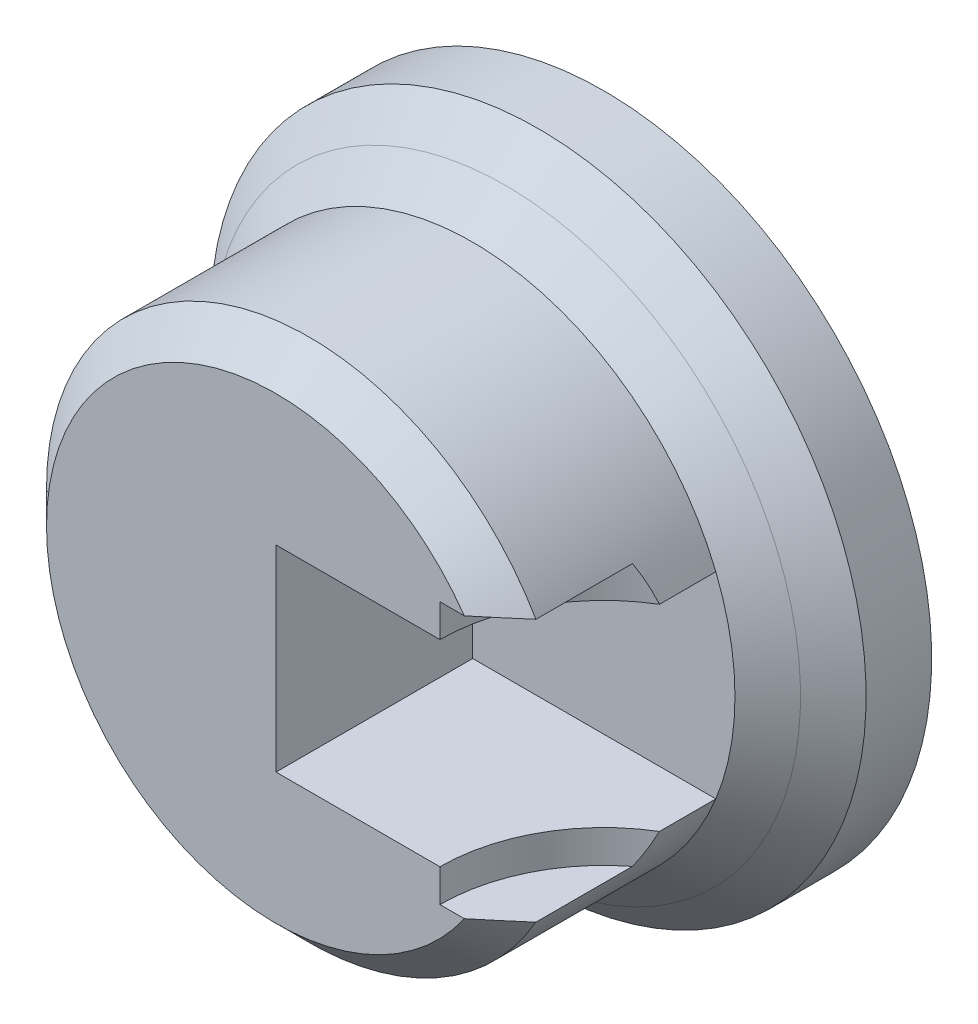
ISO-10303-21;
HEADER;
FILE_DESCRIPTION(('STEP AP214'),'2;1');
FILE_NAME('part.step','',(''),(''),'','','');
FILE_SCHEMA(('AUTOMOTIVE_DESIGN { 1 0 10303 214 1 1 1 1 }'));
ENDSEC;
DATA;
#1=APPLICATION_CONTEXT('core data for automotive mechanical design processes');
#2=APPLICATION_PROTOCOL_DEFINITION('international standard','automotive_design',2000,#1);
#3=PRODUCT_CONTEXT('',#1,'mechanical');
#4=PRODUCT('Part','Part','',(#3));
#5=PRODUCT_RELATED_PRODUCT_CATEGORY('part','',(#4));
#6=PRODUCT_DEFINITION_FORMATION('','',#4);
#7=PRODUCT_DEFINITION_CONTEXT('part definition',#1,'design');
#8=PRODUCT_DEFINITION('design','',#6,#7);
#9=PRODUCT_DEFINITION_SHAPE('','',#8);
#10=(LENGTH_UNIT() NAMED_UNIT(*) SI_UNIT(.MILLI.,.METRE.));
#11=(NAMED_UNIT(*) PLANE_ANGLE_UNIT() SI_UNIT($,.RADIAN.));
#12=(NAMED_UNIT(*) SI_UNIT($,.STERADIAN.) SOLID_ANGLE_UNIT());
#13=UNCERTAINTY_MEASURE_WITH_UNIT(LENGTH_MEASURE(1.E-05),#10,'distance_accuracy_value','');
#14=(GEOMETRIC_REPRESENTATION_CONTEXT(3) GLOBAL_UNCERTAINTY_ASSIGNED_CONTEXT((#13)) GLOBAL_UNIT_ASSIGNED_CONTEXT((#10,
#11,#12)) REPRESENTATION_CONTEXT('',''));
#15=CARTESIAN_POINT('',(0.,0.,0.));
#16=DIRECTION('',(0.,0.,1.));
#17=DIRECTION('',(1.,0.,0.));
#18=AXIS2_PLACEMENT_3D('',#15,#16,#17);
#19=CARTESIAN_POINT('',(0.,0.,-2.5));
#20=DIRECTION('',(0.,0.,1.));
#21=DIRECTION('',(1.,0.,0.));
#22=AXIS2_PLACEMENT_3D('',#19,#20,#21);
#23=CYLINDRICAL_SURFACE('',#22,4.);
#24=DIRECTION('',(0.,0.,1.));
#25=VECTOR('',#24,1.);
#26=CARTESIAN_POINT('',(3.70809924354783,1.5,-2.5));
#27=LINE('',#26,#25);
#28=CARTESIAN_POINT('',(3.70809924354783,1.5,-0.5));
#29=VERTEX_POINT('',#28);
#30=CARTESIAN_POINT('',(3.70809924354783,1.5,0.359674689333811));
#31=VERTEX_POINT('',#30);
#32=EDGE_CURVE('E160',#29,#31,#27,.T.);
#33=ORIENTED_EDGE('',*,*,#32,.F.);
#34=CARTESIAN_POINT('',(0.,0.,-0.499999999999993));
#35=DIRECTION('',(0.,0.,-1.));
#36=DIRECTION('',(-1.,0.,0.));
#37=AXIS2_PLACEMENT_3D('',#34,#35,#36);
#38=CIRCLE('',#37,4.);
#39=CARTESIAN_POINT('',(3.70809924354783,-1.5,-0.5));
#40=VERTEX_POINT('',#39);
#41=EDGE_CURVE('E207',#29,#40,#38,.F.);
#42=ORIENTED_EDGE('',*,*,#41,.T.);
#43=DIRECTION('',(0.,0.,1.));
#44=VECTOR('',#43,1.);
#45=CARTESIAN_POINT('',(3.70809924354783,-1.5,-2.5));
#46=LINE('',#45,#44);
#47=CARTESIAN_POINT('',(3.70809924354783,-1.5,0.35967468933381));
#48=VERTEX_POINT('',#47);
#49=EDGE_CURVE('E155',#48,#40,#46,.F.);
#50=ORIENTED_EDGE('',*,*,#49,.F.);
#51=CARTESIAN_POINT('',(3.46410161513775,2.,0.527434119889135));
#52=CARTESIAN_POINT('',(3.50562560971937,1.92814357787621,0.495137636151299));
#53=CARTESIAN_POINT('',(3.54547378311927,1.8538966149574,0.466179679588769));
#54=CARTESIAN_POINT('',(3.62106919687792,1.70147423965995,0.414169698945883));
#55=CARTESIAN_POINT('',(3.65682155860498,1.62330391296189,0.391110253912465));
#56=CARTESIAN_POINT('',(3.72340968799511,1.46412004738074,0.35015615388205));
#57=CARTESIAN_POINT('',(3.7542702358269,1.3831235524039,0.33223506974557));
#58=CARTESIAN_POINT('',(3.81087414223492,1.21852794952602,0.300674582364985));
#59=CARTESIAN_POINT('',(3.83661587759851,1.13492802574792,0.287036536511759));
#60=CARTESIAN_POINT('',(3.88254630052729,0.966151558570928,0.263493961082745));
#61=CARTESIAN_POINT('',(3.90276125512357,0.880984601373542,0.253571685320262));
#62=CARTESIAN_POINT('',(3.93760713534529,0.709180013785521,0.236883846416933));
#63=CARTESIAN_POINT('',(3.95223583937106,0.622541812571346,0.23011953893306));
#64=CARTESIAN_POINT('',(3.9757927456931,0.448141519221125,0.219393182310386));
#65=CARTESIAN_POINT('',(3.98470914391553,0.360377479665854,0.215436934018808));
#66=CARTESIAN_POINT('',(3.99672002419088,0.184405444560203,0.210137222534614));
#67=CARTESIAN_POINT('',(3.99981636699115,0.0961975999464612,0.208792924262999));
#68=CARTESIAN_POINT('',(4.00019301838751,-0.0929452407603397,0.208627194307258));
#69=CARTESIAN_POINT('',(3.99657159580003,-0.193883837629049,0.210196937936196));
#70=CARTESIAN_POINT('',(3.98171753979444,-0.395100431380641,0.216764118358967));
#71=CARTESIAN_POINT('',(3.97048388136726,-0.495378337463306,0.221762016764639));
#72=CARTESIAN_POINT('',(3.94055285783935,-0.694368587490894,0.235525963342368));
#73=CARTESIAN_POINT('',(3.92186909355035,-0.793083445342959,0.244285147191498));
#74=CARTESIAN_POINT('',(3.877260654915,-0.988369660654506,0.266152498247121));
#75=CARTESIAN_POINT('',(3.8513373380852,-1.08494141631418,0.279259850198244));
#76=CARTESIAN_POINT('',(3.79947925386363,-1.25290860601893,0.306966252714676));
#77=CARTESIAN_POINT('',(3.77495922905565,-1.32491958560395,0.320503184109033));
#78=CARTESIAN_POINT('',(3.72214021702008,-1.46676447534039,0.351045728107578));
#79=CARTESIAN_POINT('',(3.69384271492068,-1.53659922784149,0.368049978902096));
#80=CARTESIAN_POINT('',(3.63370332425191,-1.67386320260022,0.406078529615961));
#81=CARTESIAN_POINT('',(3.60185155528957,-1.74128499462203,0.427114158691209));
#82=CARTESIAN_POINT('',(3.53512079608088,-1.87307881564676,0.473730727303688));
#83=CARTESIAN_POINT('',(3.5002386127911,-1.93744751459084,0.49931649161482));
#84=CARTESIAN_POINT('',(3.46410161513775,-2.00000000000001,0.527434119889046));
#85=B_SPLINE_CURVE_WITH_KNOTS('',3,(#51,#52,#53,#54,#55,#56,#57,#58,#59,#60,#61,#62,#63,#64,#65,
#66,#67,#68,#69,#70,#71,#72,#73,#74,#75,#76,#77,#78,#79,#80,#81,#82,#83,#84),.UNSPECIFIED.,.F.,
.F.,(4,2,2,2,2,2,2,2,2,2,2,2,2,2,2,2,4),(0.,0.266963377276629,0.533589215792938,
0.79881800008297,1.06413075669451,1.32815973494611,1.59229360597407,1.85697154518002,
2.12156484900632,2.42426023919567,2.7269963962763,3.02918239426479,3.33131176618847,
3.56292706563589,3.79445157145347,4.02663652011698,4.25906915215576),.UNSPECIFIED.);
#86=CARTESIAN_POINT('',(3.46410161513775,-2.,0.527434119889135));
#87=VERTEX_POINT('',#86);
#88=EDGE_CURVE('E124',#48,#87,#85,.T.);
#89=ORIENTED_EDGE('',*,*,#88,.T.);
#90=DIRECTION('',(0.,0.,1.));
#91=VECTOR('',#90,1.);
#92=CARTESIAN_POINT('',(3.46410161513775,-2.,-2.5));
#93=LINE('',#92,#91);
#94=CARTESIAN_POINT('',(3.46410161513775,-2.,2.));
#95=VERTEX_POINT('',#94);
#96=EDGE_CURVE('E121',#87,#95,#93,.T.);
#97=ORIENTED_EDGE('',*,*,#96,.T.);
#98=CARTESIAN_POINT('',(0.,0.,2.));
#99=DIRECTION('',(0.,0.,1.));
#100=DIRECTION('',(1.,0.,0.));
#101=AXIS2_PLACEMENT_3D('',#98,#99,#100);
#102=CIRCLE('',#101,4.);
#103=CARTESIAN_POINT('',(3.46410161513775,2.,2.));
#104=VERTEX_POINT('',#103);
#105=EDGE_CURVE('E55',#95,#104,#102,.F.);
#106=ORIENTED_EDGE('',*,*,#105,.T.);
#107=DIRECTION('',(0.,0.,1.));
#108=VECTOR('',#107,1.);
#109=CARTESIAN_POINT('',(3.46410161513775,2.,-2.5));
#110=LINE('',#109,#108);
#111=CARTESIAN_POINT('',(3.46410161513775,2.,0.527434119889135));
#112=VERTEX_POINT('',#111);
#113=EDGE_CURVE('E127',#112,#104,#110,.T.);
#114=ORIENTED_EDGE('',*,*,#113,.F.);
#115=EDGE_CURVE('E112',#112,#31,#85,.T.);
#116=ORIENTED_EDGE('',*,*,#115,.T.);
#117=EDGE_LOOP('',(#33,#42,#50,#89,#97,#106,#114,#116));
#118=FACE_BOUND('',#117,.T.);
#119=ADVANCED_FACE('F39',(#118),#23,.T.);
#120=CARTESIAN_POINT('',(0.,0.,2.5));
#121=DIRECTION('',(0.,0.,1.));
#122=DIRECTION('',(1.,0.,0.));
#123=AXIS2_PLACEMENT_3D('',#120,#121,#122);
#124=PLANE('',#123);
#125=DIRECTION('',(-1.,0.,0.));
#126=VECTOR('',#125,1.);
#127=CARTESIAN_POINT('',(0.,2.,2.5));
#128=LINE('',#127,#126);
#129=CARTESIAN_POINT('',(2.87228132326901,2.,2.5));
#130=VERTEX_POINT('',#129);
#131=CARTESIAN_POINT('',(2.5,2.,2.5));
#132=VERTEX_POINT('',#131);
#133=EDGE_CURVE('E130',#130,#132,#128,.T.);
#134=ORIENTED_EDGE('',*,*,#133,.F.);
#135=CARTESIAN_POINT('',(0.,0.,2.5));
#136=DIRECTION('',(0.,0.,1.));
#137=DIRECTION('',(1.,0.,0.));
#138=AXIS2_PLACEMENT_3D('',#135,#136,#137);
#139=CIRCLE('',#138,3.5);
#140=CARTESIAN_POINT('',(2.87228132326901,-2.,2.5));
#141=VERTEX_POINT('',#140);
#142=EDGE_CURVE('E172',#130,#141,#139,.T.);
#143=ORIENTED_EDGE('',*,*,#142,.T.);
#144=DIRECTION('',(-1.,0.,0.));
#145=VECTOR('',#144,1.);
#146=CARTESIAN_POINT('',(0.,-2.,2.5));
#147=LINE('',#146,#145);
#148=CARTESIAN_POINT('',(2.5,-2.,2.5));
#149=VERTEX_POINT('',#148);
#150=EDGE_CURVE('E169',#141,#149,#147,.T.);
#151=ORIENTED_EDGE('',*,*,#150,.T.);
#152=DIRECTION('',(0.,-1.,0.));
#153=VECTOR('',#152,1.);
#154=CARTESIAN_POINT('',(2.5,2.,2.5));
#155=LINE('',#154,#153);
#156=CARTESIAN_POINT('',(2.5,-1.5,2.5));
#157=VERTEX_POINT('',#156);
#158=EDGE_CURVE('E131',#149,#157,#155,.F.);
#159=ORIENTED_EDGE('',*,*,#158,.T.);
#160=DIRECTION('',(1.,0.,0.));
#161=VECTOR('',#160,1.);
#162=CARTESIAN_POINT('',(7.99999999999999,-1.49999999999999,2.5));
#163=LINE('',#162,#161);
#164=CARTESIAN_POINT('',(0.,-1.5,2.5));
#165=VERTEX_POINT('',#164);
#166=EDGE_CURVE('E137',#165,#157,#163,.T.);
#167=ORIENTED_EDGE('',*,*,#166,.F.);
#168=DIRECTION('',(0.,-1.,0.));
#169=VECTOR('',#168,1.);
#170=CARTESIAN_POINT('',(0.,-1.5,2.5));
#171=LINE('',#170,#169);
#172=CARTESIAN_POINT('',(0.,1.5,2.5));
#173=VERTEX_POINT('',#172);
#174=EDGE_CURVE('E134',#173,#165,#171,.T.);
#175=ORIENTED_EDGE('',*,*,#174,.F.);
#176=DIRECTION('',(-1.,0.,0.));
#177=VECTOR('',#176,1.);
#178=CARTESIAN_POINT('',(0.,1.5,2.5));
#179=LINE('',#178,#177);
#180=CARTESIAN_POINT('',(2.5,1.5,2.5));
#181=VERTEX_POINT('',#180);
#182=EDGE_CURVE('E162',#181,#173,#179,.T.);
#183=ORIENTED_EDGE('',*,*,#182,.F.);
#184=EDGE_CURVE('E122',#181,#132,#155,.F.);
#185=ORIENTED_EDGE('',*,*,#184,.T.);
#186=EDGE_LOOP('',(#134,#143,#151,#159,#167,#175,#183,#185));
#187=FACE_BOUND('',#186,.T.);
#188=ADVANCED_FACE('F229',(#187),#124,.T.);
#189=CARTESIAN_POINT('',(7.99999999999999,1.5,-0.5));
#190=DIRECTION('',(0.,1.,0.));
#191=DIRECTION('',(-1.,0.,0.));
#192=AXIS2_PLACEMENT_3D('',#189,#190,#191);
#193=PLANE('',#192);
#194=CARTESIAN_POINT('',(5.,1.5,2.5));
#195=DIRECTION('',(0.,1.,0.));
#196=DIRECTION('',(-1.,0.,0.));
#197=AXIS2_PLACEMENT_3D('',#194,#195,#196);
#198=CIRCLE('',#197,2.5);
#199=EDGE_CURVE('E118',#181,#31,#198,.F.);
#200=ORIENTED_EDGE('',*,*,#199,.F.);
#201=ORIENTED_EDGE('',*,*,#182,.T.);
#202=DIRECTION('',(0.,0.,1.));
#203=VECTOR('',#202,1.);
#204=CARTESIAN_POINT('',(0.,1.5,-0.5));
#205=LINE('',#204,#203);
#206=CARTESIAN_POINT('',(0.,1.5,-0.5));
#207=VERTEX_POINT('',#206);
#208=EDGE_CURVE('E149',#207,#173,#205,.T.);
#209=ORIENTED_EDGE('',*,*,#208,.F.);
#210=DIRECTION('',(-1.,0.,0.));
#211=VECTOR('',#210,1.);
#212=CARTESIAN_POINT('',(7.99999999999999,1.5,-0.5));
#213=LINE('',#212,#211);
#214=EDGE_CURVE('E142',#29,#207,#213,.T.);
#215=ORIENTED_EDGE('',*,*,#214,.F.);
#216=ORIENTED_EDGE('',*,*,#32,.T.);
#217=EDGE_LOOP('',(#200,#201,#209,#215,#216));
#218=FACE_BOUND('',#217,.T.);
#219=ADVANCED_FACE('F243',(#218),#193,.F.);
#220=CARTESIAN_POINT('',(7.99999999999999,-1.49999999999999,-0.5));
#221=DIRECTION('',(0.,-1.,0.));
#222=DIRECTION('',(1.,0.,0.));
#223=AXIS2_PLACEMENT_3D('',#220,#221,#222);
#224=PLANE('',#223);
#225=CARTESIAN_POINT('',(5.,-1.5,2.5));
#226=DIRECTION('',(0.,-1.,0.));
#227=DIRECTION('',(1.,0.,0.));
#228=AXIS2_PLACEMENT_3D('',#225,#226,#227);
#229=CIRCLE('',#228,2.5);
#230=EDGE_CURVE('E167',#48,#157,#229,.F.);
#231=ORIENTED_EDGE('',*,*,#230,.F.);
#232=ORIENTED_EDGE('',*,*,#49,.T.);
#233=DIRECTION('',(1.,0.,0.));
#234=VECTOR('',#233,1.);
#235=CARTESIAN_POINT('',(7.99999999999999,-1.49999999999999,-0.5));
#236=LINE('',#235,#234);
#237=CARTESIAN_POINT('',(0.,-1.5,-0.5));
#238=VERTEX_POINT('',#237);
#239=EDGE_CURVE('E147',#238,#40,#236,.T.);
#240=ORIENTED_EDGE('',*,*,#239,.F.);
#241=DIRECTION('',(0.,0.,1.));
#242=VECTOR('',#241,1.);
#243=CARTESIAN_POINT('',(0.,-1.5,-0.5));
#244=LINE('',#243,#242);
#245=EDGE_CURVE('E153',#238,#165,#244,.T.);
#246=ORIENTED_EDGE('',*,*,#245,.T.);
#247=ORIENTED_EDGE('',*,*,#166,.T.);
#248=EDGE_LOOP('',(#231,#232,#240,#246,#247));
#249=FACE_BOUND('',#248,.T.);
#250=ADVANCED_FACE('F235',(#249),#224,.F.);
#251=CARTESIAN_POINT('',(0.,-1.5,-0.5));
#252=DIRECTION('',(-1.,0.,0.));
#253=DIRECTION('',(0.,-1.,0.));
#254=AXIS2_PLACEMENT_3D('',#251,#252,#253);
#255=PLANE('',#254);
#256=ORIENTED_EDGE('',*,*,#174,.T.);
#257=ORIENTED_EDGE('',*,*,#245,.F.);
#258=DIRECTION('',(0.,-1.,0.));
#259=VECTOR('',#258,1.);
#260=CARTESIAN_POINT('',(0.,-1.5,-0.5));
#261=LINE('',#260,#259);
#262=EDGE_CURVE('E144',#207,#238,#261,.T.);
#263=ORIENTED_EDGE('',*,*,#262,.F.);
#264=ORIENTED_EDGE('',*,*,#208,.T.);
#265=EDGE_LOOP('',(#256,#257,#263,#264));
#266=FACE_BOUND('',#265,.T.);
#267=ADVANCED_FACE('F240',(#266),#255,.F.);
#268=CARTESIAN_POINT('',(0.,0.,-0.5));
#269=DIRECTION('',(0.,0.,-1.));
#270=DIRECTION('',(-1.,0.,0.));
#271=AXIS2_PLACEMENT_3D('',#268,#269,#270);
#272=PLANE('',#271);
#273=CARTESIAN_POINT('',(0.,0.,-0.5));
#274=DIRECTION('',(0.,0.,-1.));
#275=DIRECTION('',(-1.,0.,0.));
#276=AXIS2_PLACEMENT_3D('',#273,#274,#275);
#277=CIRCLE('',#276,4.);
#278=EDGE_CURVE('E164',#40,#29,#277,.F.);
#279=ORIENTED_EDGE('',*,*,#278,.T.);
#280=ORIENTED_EDGE('',*,*,#214,.T.);
#281=ORIENTED_EDGE('',*,*,#262,.T.);
#282=ORIENTED_EDGE('',*,*,#239,.T.);
#283=EDGE_LOOP('',(#279,#280,#281,#282));
#284=FACE_BOUND('',#283,.T.);
#285=ADVANCED_FACE('F215',(#284),#272,.F.);
#286=CARTESIAN_POINT('',(5.,2.,2.5));
#287=DIRECTION('',(0.,-1.,0.));
#288=DIRECTION('',(0.,0.,-1.));
#289=AXIS2_PLACEMENT_3D('',#286,#287,#288);
#290=CYLINDRICAL_SURFACE('',#289,2.5);
#291=ORIENTED_EDGE('',*,*,#230,.T.);
#292=ORIENTED_EDGE('',*,*,#158,.F.);
#293=CARTESIAN_POINT('',(5.,-2.,2.5));
#294=DIRECTION('',(0.,1.,0.));
#295=DIRECTION('',(0.,0.,1.));
#296=AXIS2_PLACEMENT_3D('',#293,#294,#295);
#297=CIRCLE('',#296,2.5);
#298=EDGE_CURVE('E132',#87,#149,#297,.T.);
#299=ORIENTED_EDGE('',*,*,#298,.F.);
#300=ORIENTED_EDGE('',*,*,#88,.F.);
#301=EDGE_LOOP('',(#291,#292,#299,#300));
#302=FACE_BOUND('',#301,.T.);
#303=ADVANCED_FACE('F211',(#302),#290,.F.);
#304=CARTESIAN_POINT('',(5.,-2.,2.5));
#305=DIRECTION('',(0.,1.,0.));
#306=DIRECTION('',(0.,0.,1.));
#307=AXIS2_PLACEMENT_3D('',#304,#305,#306);
#308=PLANE('',#307);
#309=ORIENTED_EDGE('',*,*,#150,.F.);
#310=CARTESIAN_POINT('',(2.87228132326901,-2.,2.5));
#311=CARTESIAN_POINT('',(2.92219200388667,-2.,2.45903866958506));
#312=CARTESIAN_POINT('',(2.97193339789598,-2.,2.417871776333));
#313=CARTESIAN_POINT('',(3.07110851751143,-2.,2.33517330531056));
#314=CARTESIAN_POINT('',(3.12054225641917,-2.,2.29364174349662));
#315=CARTESIAN_POINT('',(3.2191369006226,-2.,2.21025714897942));
#316=CARTESIAN_POINT('',(3.2682978081867,-2.,2.16840411895587));
#317=CARTESIAN_POINT('',(3.36637615611675,-2.,2.08440938461169));
#318=CARTESIAN_POINT('',(3.41529358579714,-2.,2.04226766781094));
#319=CARTESIAN_POINT('',(3.46410161513776,-2.,2.00000000000001));
#320=B_SPLINE_CURVE_WITH_KNOTS('',3,(#310,#311,#312,#313,#314,#315,#316,#317,#318,#319),
.UNSPECIFIED.,.F.,.F.,(4,2,2,2,4),(0.,0.193700015339948,0.387391596969621,0.581081565764458,
0.774779961417527),.UNSPECIFIED.);
#321=EDGE_CURVE('E63',#141,#95,#320,.T.);
#322=ORIENTED_EDGE('',*,*,#321,.T.);
#323=ORIENTED_EDGE('',*,*,#96,.F.);
#324=ORIENTED_EDGE('',*,*,#298,.T.);
#325=EDGE_LOOP('',(#309,#322,#323,#324));
#326=FACE_BOUND('',#325,.T.);
#327=ADVANCED_FACE('F183',(#326),#308,.T.);
#328=CARTESIAN_POINT('',(5.,2.,2.5));
#329=DIRECTION('',(0.,1.,0.));
#330=DIRECTION('',(0.,0.,1.));
#331=AXIS2_PLACEMENT_3D('',#328,#329,#330);
#332=CIRCLE('',#331,2.5);
#333=EDGE_CURVE('E115',#112,#132,#332,.T.);
#334=ORIENTED_EDGE('',*,*,#333,.T.);
#335=ORIENTED_EDGE('',*,*,#184,.F.);
#336=ORIENTED_EDGE('',*,*,#199,.T.);
#337=ORIENTED_EDGE('',*,*,#115,.F.);
#338=EDGE_LOOP('',(#334,#335,#336,#337));
#339=FACE_BOUND('',#338,.T.);
#340=ADVANCED_FACE('F114',(#339),#290,.F.);
#341=CARTESIAN_POINT('',(5.,2.,2.5));
#342=DIRECTION('',(0.,1.,0.));
#343=DIRECTION('',(0.,0.,1.));
#344=AXIS2_PLACEMENT_3D('',#341,#342,#343);
#345=PLANE('',#344);
#346=ORIENTED_EDGE('',*,*,#113,.T.);
#347=CARTESIAN_POINT('',(3.46410161513775,2.,2.));
#348=CARTESIAN_POINT('',(3.41529358579714,2.,2.04226766781093));
#349=CARTESIAN_POINT('',(3.36637615611675,2.,2.08440938461168));
#350=CARTESIAN_POINT('',(3.2682978081867,2.,2.16840411895587));
#351=CARTESIAN_POINT('',(3.2191369006226,2.,2.21025714897942));
#352=CARTESIAN_POINT('',(3.12054225641917,2.,2.29364174349662));
#353=CARTESIAN_POINT('',(3.07110851751143,2.,2.33517330531056));
#354=CARTESIAN_POINT('',(2.97193339789598,2.,2.417871776333));
#355=CARTESIAN_POINT('',(2.92219200388668,2.,2.45903866958507));
#356=CARTESIAN_POINT('',(2.87228132326903,2.,2.50000000000002));
#357=B_SPLINE_CURVE_WITH_KNOTS('',3,(#347,#348,#349,#350,#351,#352,#353,#354,#355,#356),
.UNSPECIFIED.,.F.,.F.,(4,2,2,2,4),(0.,0.19369839565307,0.387388364447906,0.581079946077579,
0.774779961417526),.UNSPECIFIED.);
#358=EDGE_CURVE('E201',#104,#130,#357,.T.);
#359=ORIENTED_EDGE('',*,*,#358,.T.);
#360=ORIENTED_EDGE('',*,*,#133,.T.);
#361=ORIENTED_EDGE('',*,*,#333,.F.);
#362=EDGE_LOOP('',(#346,#359,#360,#361));
#363=FACE_BOUND('',#362,.T.);
#364=ADVANCED_FACE('F126',(#363),#345,.F.);
#365=CARTESIAN_POINT('',(0.,0.,2.5));
#366=DIRECTION('',(0.,0.,-1.));
#367=DIRECTION('',(-1.,0.,0.));
#368=AXIS2_PLACEMENT_3D('',#365,#366,#367);
#369=CONICAL_SURFACE('',#368,3.5,0.785398163397448);
#370=ORIENTED_EDGE('',*,*,#358,.F.);
#371=ORIENTED_EDGE('',*,*,#105,.F.);
#372=ORIENTED_EDGE('',*,*,#321,.F.);
#373=ORIENTED_EDGE('',*,*,#142,.F.);
#374=EDGE_LOOP('',(#370,#371,#372,#373));
#375=FACE_BOUND('',#374,.T.);
#376=ADVANCED_FACE('F188',(#375),#369,.T.);
#377=CARTESIAN_POINT('',(0.,0.,-1.));
#378=DIRECTION('',(0.,0.,-1.));
#379=DIRECTION('',(-1.,0.,0.));
#380=AXIS2_PLACEMENT_3D('',#377,#378,#379);
#381=CYLINDRICAL_SURFACE('',#380,5.);
#382=CARTESIAN_POINT('',(0.,0.,-1.5));
#383=DIRECTION('',(0.,0.,-1.));
#384=DIRECTION('',(-1.,0.,0.));
#385=AXIS2_PLACEMENT_3D('',#382,#383,#384);
#386=CIRCLE('',#385,5.);
#387=CARTESIAN_POINT('',(-5.,0.,-1.5));
#388=VERTEX_POINT('',#387);
#389=EDGE_CURVE('E11',#388,#388,#386,.T.);
#390=ORIENTED_EDGE('',*,*,#389,.T.);
#391=EDGE_LOOP('',(#390));
#392=FACE_BOUND('',#391,.T.);
#393=CARTESIAN_POINT('',(0.,0.,-2.5));
#394=DIRECTION('',(0.,0.,-1.));
#395=DIRECTION('',(-1.,0.,0.));
#396=AXIS2_PLACEMENT_3D('',#393,#394,#395);
#397=CIRCLE('',#396,5.);
#398=CARTESIAN_POINT('',(-5.,0.,-2.5));
#399=VERTEX_POINT('',#398);
#400=EDGE_CURVE('E366',#399,#399,#397,.T.);
#401=ORIENTED_EDGE('',*,*,#400,.F.);
#402=EDGE_LOOP('',(#401));
#403=FACE_BOUND('',#402,.T.);
#404=ADVANCED_FACE('F195',(#392,#403),#381,.T.);
#405=CARTESIAN_POINT('',(0.,0.,-2.5));
#406=DIRECTION('',(0.,0.,1.));
#407=DIRECTION('',(1.,0.,0.));
#408=AXIS2_PLACEMENT_3D('',#405,#406,#407);
#409=PLANE('',#408);
#410=ORIENTED_EDGE('',*,*,#400,.T.);
#411=EDGE_LOOP('',(#410));
#412=FACE_BOUND('',#411,.T.);
#413=ADVANCED_FACE('F249',(#412),#409,.F.);
#414=CARTESIAN_POINT('',(0.,0.,-0.499999999999993));
#415=DIRECTION('',(0.,0.,-1.));
#416=DIRECTION('',(-1.,0.,0.));
#417=AXIS2_PLACEMENT_3D('',#414,#415,#416);
#418=CONICAL_SURFACE('',#417,4.,0.785398163397441);
#419=CARTESIAN_POINT('',(0.,0.,-1.));
#420=DIRECTION('',(0.,0.,-1.));
#421=DIRECTION('',(-1.,0.,0.));
#422=AXIS2_PLACEMENT_3D('',#419,#420,#421);
#423=CIRCLE('',#422,4.5);
#424=CARTESIAN_POINT('',(-4.5,0.,-1.));
#425=VERTEX_POINT('',#424);
#426=EDGE_CURVE('E48',#425,#425,#423,.T.);
#427=ORIENTED_EDGE('',*,*,#426,.F.);
#428=EDGE_LOOP('',(#427));
#429=FACE_BOUND('',#428,.T.);
#430=ORIENTED_EDGE('',*,*,#41,.F.);
#431=ORIENTED_EDGE('',*,*,#278,.F.);
#432=EDGE_LOOP('',(#430,#431));
#433=FACE_BOUND('',#432,.T.);
#434=ADVANCED_FACE('F199',(#429,#433),#418,.T.);
#435=CARTESIAN_POINT('',(0.,0.,-1.5));
#436=DIRECTION('',(0.,0.,-1.));
#437=DIRECTION('',(-1.,0.,0.));
#438=AXIS2_PLACEMENT_3D('',#435,#436,#437);
#439=CONICAL_SURFACE('',#438,5.,0.78539816339745);
#440=ORIENTED_EDGE('',*,*,#426,.T.);
#441=EDGE_LOOP('',(#440));
#442=FACE_BOUND('',#441,.T.);
#443=ORIENTED_EDGE('',*,*,#389,.F.);
#444=EDGE_LOOP('',(#443));
#445=FACE_BOUND('',#444,.T.);
#446=ADVANCED_FACE('F42',(#442,#445),#439,.T.);
#447=CLOSED_SHELL('',(#119,#188,#219,#250,#267,#285,#303,#327,#340,#364,#376,#404,#413,#434,#446));
#448=MANIFOLD_SOLID_BREP('B2',#447);
#449=ADVANCED_BREP_SHAPE_REPRESENTATION('',(#18,#448),#14);
#450=SHAPE_DEFINITION_REPRESENTATION(#9,#449);
ENDSEC;
END-ISO-10303-21;
